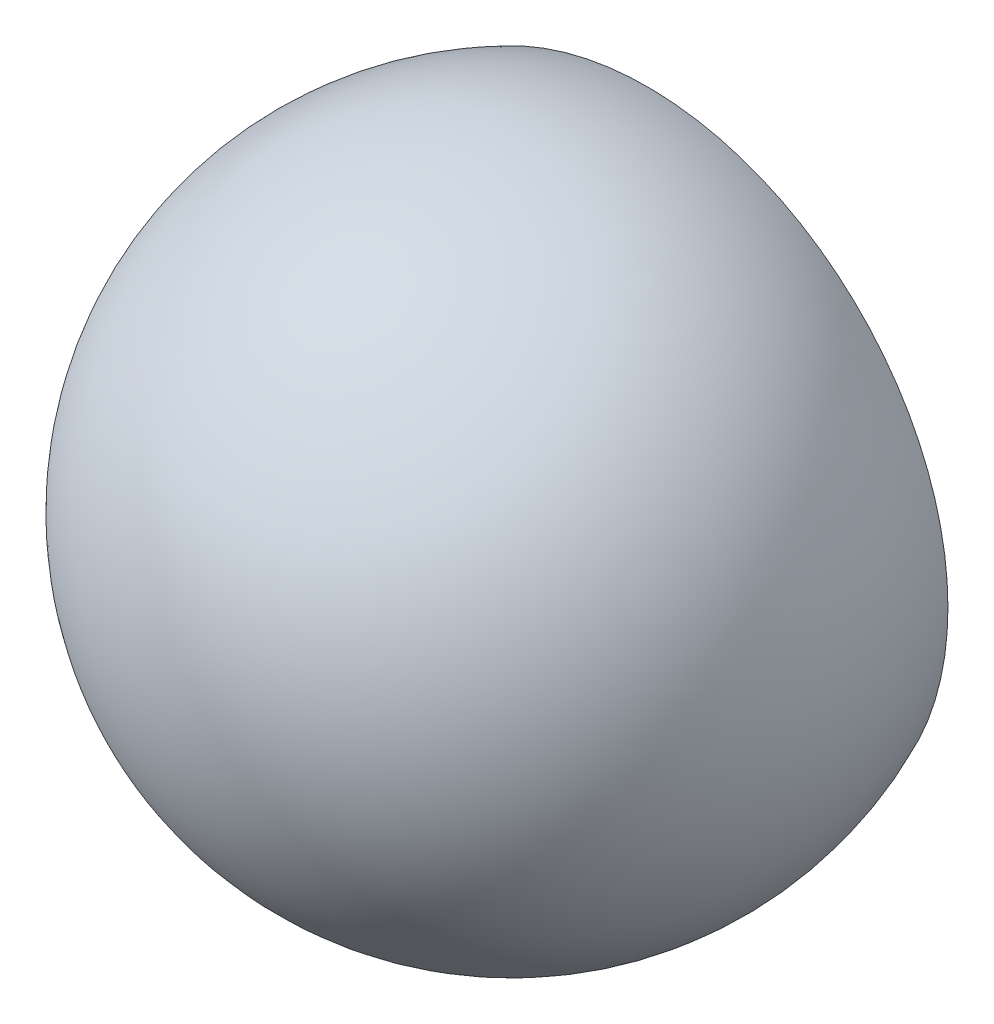
ISO-10303-21;
HEADER;
FILE_DESCRIPTION(('STEP AP214'),'2;1');
FILE_NAME('part.step','',(''),(''),'','','');
FILE_SCHEMA(('AUTOMOTIVE_DESIGN { 1 0 10303 214 1 1 1 1 }'));
ENDSEC;
DATA;
#1=APPLICATION_CONTEXT('core data for automotive mechanical design processes');
#2=APPLICATION_PROTOCOL_DEFINITION('international standard','automotive_design',2000,#1);
#3=PRODUCT_CONTEXT('',#1,'mechanical');
#4=PRODUCT('Part','Part','',(#3));
#5=PRODUCT_RELATED_PRODUCT_CATEGORY('part','',(#4));
#6=PRODUCT_DEFINITION_FORMATION('','',#4);
#7=PRODUCT_DEFINITION_CONTEXT('part definition',#1,'design');
#8=PRODUCT_DEFINITION('design','',#6,#7);
#9=PRODUCT_DEFINITION_SHAPE('','',#8);
#10=(LENGTH_UNIT() NAMED_UNIT(*) SI_UNIT(.MILLI.,.METRE.));
#11=(NAMED_UNIT(*) PLANE_ANGLE_UNIT() SI_UNIT($,.RADIAN.));
#12=(NAMED_UNIT(*) SI_UNIT($,.STERADIAN.) SOLID_ANGLE_UNIT());
#13=UNCERTAINTY_MEASURE_WITH_UNIT(LENGTH_MEASURE(1.E-05),#10,'distance_accuracy_value','');
#14=(GEOMETRIC_REPRESENTATION_CONTEXT(3) GLOBAL_UNCERTAINTY_ASSIGNED_CONTEXT((#13)) GLOBAL_UNIT_ASSIGNED_CONTEXT((#10,
#11,#12)) REPRESENTATION_CONTEXT('',''));
#15=CARTESIAN_POINT('',(0.,0.,0.));
#16=DIRECTION('',(0.,0.,1.));
#17=DIRECTION('',(1.,0.,0.));
#18=AXIS2_PLACEMENT_3D('',#15,#16,#17);
#19=CARTESIAN_POINT('',(0.,0.,0.));
#20=DIRECTION('',(0.,1.,0.));
#21=DIRECTION('',(1.,0.,0.));
#22=AXIS2_PLACEMENT_3D('',#19,#20,#21);
#23=SPHERICAL_SURFACE('',#22,4.87);
#24=CARTESIAN_POINT('',(0.,0.,0.));
#25=DIRECTION('',(0.,0.,1.));
#26=DIRECTION('',(1.,0.,0.));
#27=AXIS2_PLACEMENT_3D('',#24,#25,#26);
#28=SPHERICAL_SURFACE('',#27,4.87);
#29=CARTESIAN_POINT('',(0.,0.,-2.));
#30=DIRECTION('',(0.,0.,1.));
#31=DIRECTION('',(1.,0.,0.));
#32=AXIS2_PLACEMENT_3D('',#29,#30,#31);
#33=CIRCLE('',#32,4.44037160607083);
#34=CARTESIAN_POINT('',(4.44037160607083,0.,-2.));
#35=VERTEX_POINT('',#34);
#36=EDGE_CURVE('E10',#35,#35,#33,.F.);
#37=ORIENTED_EDGE('',*,*,#36,.F.);
#38=EDGE_LOOP('',(#37));
#39=FACE_BOUND('',#38,.T.);
#40=ADVANCED_FACE('F30',(#39),#28,.T.);
#41=CARTESIAN_POINT('',(-4.87,4.87,-2.));
#42=DIRECTION('',(0.,0.,1.));
#43=DIRECTION('',(1.,0.,0.));
#44=AXIS2_PLACEMENT_3D('',#41,#42,#43);
#45=PLANE('',#44);
#46=ORIENTED_EDGE('',*,*,#36,.T.);
#47=EDGE_LOOP('',(#46));
#48=FACE_BOUND('',#47,.T.);
#49=ADVANCED_FACE('F37',(#48),#45,.F.);
#50=CLOSED_SHELL('',(#40,#49));
#51=MANIFOLD_SOLID_BREP('B2',#50);
#52=ADVANCED_BREP_SHAPE_REPRESENTATION('',(#18,#51),#14);
#53=SHAPE_DEFINITION_REPRESENTATION(#9,#52);
ENDSEC;
END-ISO-10303-21;
